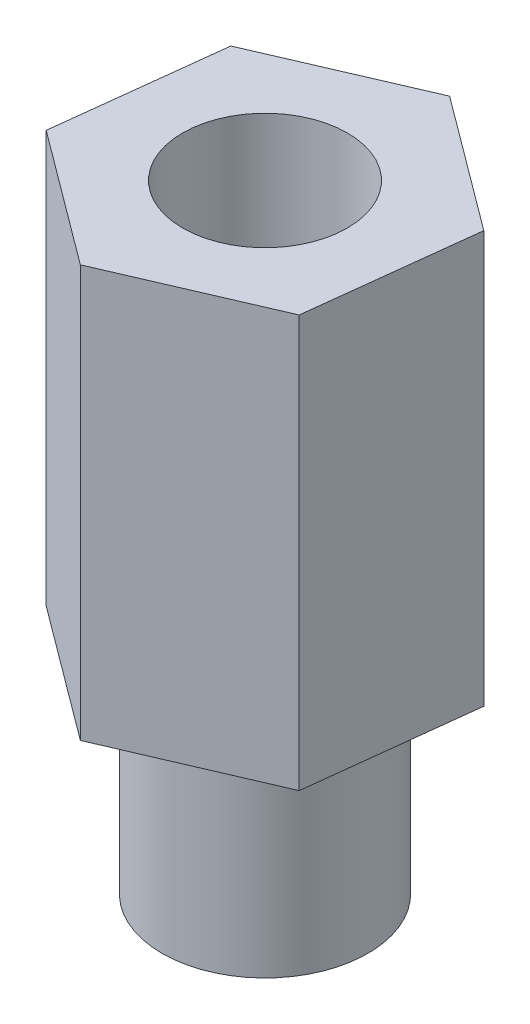
ISO-10303-21;
HEADER;
FILE_DESCRIPTION(('STEP AP214'),'2;1');
FILE_NAME('part.step','',(''),(''),'','','');
FILE_SCHEMA(('AUTOMOTIVE_DESIGN { 1 0 10303 214 1 1 1 1 }'));
ENDSEC;
DATA;
#1=APPLICATION_CONTEXT('core data for automotive mechanical design processes');
#2=APPLICATION_PROTOCOL_DEFINITION('international standard','automotive_design',2000,#1);
#3=PRODUCT_CONTEXT('',#1,'mechanical');
#4=PRODUCT('Part','Part','',(#3));
#5=PRODUCT_RELATED_PRODUCT_CATEGORY('part','',(#4));
#6=PRODUCT_DEFINITION_FORMATION('','',#4);
#7=PRODUCT_DEFINITION_CONTEXT('part definition',#1,'design');
#8=PRODUCT_DEFINITION('design','',#6,#7);
#9=PRODUCT_DEFINITION_SHAPE('','',#8);
#10=(LENGTH_UNIT() NAMED_UNIT(*) SI_UNIT(.MILLI.,.METRE.));
#11=(NAMED_UNIT(*) PLANE_ANGLE_UNIT() SI_UNIT($,.RADIAN.));
#12=(NAMED_UNIT(*) SI_UNIT($,.STERADIAN.) SOLID_ANGLE_UNIT());
#13=UNCERTAINTY_MEASURE_WITH_UNIT(LENGTH_MEASURE(1.E-05),#10,'distance_accuracy_value','');
#14=(GEOMETRIC_REPRESENTATION_CONTEXT(3) GLOBAL_UNCERTAINTY_ASSIGNED_CONTEXT((#13)) GLOBAL_UNIT_ASSIGNED_CONTEXT((#10,
#11,#12)) REPRESENTATION_CONTEXT('',''));
#15=CARTESIAN_POINT('',(0.,0.,0.));
#16=DIRECTION('',(0.,0.,1.));
#17=DIRECTION('',(1.,0.,0.));
#18=AXIS2_PLACEMENT_3D('',#15,#16,#17);
#19=CARTESIAN_POINT('',(0.,10.,0.));
#20=DIRECTION('',(0.,-1.,0.));
#21=DIRECTION('',(0.,0.,-1.));
#22=AXIS2_PLACEMENT_3D('',#19,#20,#21);
#23=CYLINDRICAL_SURFACE('',#22,5.);
#24=CARTESIAN_POINT('',(0.,10.,0.));
#25=DIRECTION('',(0.,1.,0.));
#26=DIRECTION('',(0.,0.,1.));
#27=AXIS2_PLACEMENT_3D('',#24,#25,#26);
#28=CIRCLE('',#27,5.);
#29=CARTESIAN_POINT('',(0.,10.,5.));
#30=VERTEX_POINT('',#29);
#31=EDGE_CURVE('E11',#30,#30,#28,.T.);
#32=ORIENTED_EDGE('',*,*,#31,.F.);
#33=EDGE_LOOP('',(#32));
#34=FACE_BOUND('',#33,.T.);
#35=CARTESIAN_POINT('',(0.,0.,0.));
#36=DIRECTION('',(0.,1.,0.));
#37=DIRECTION('',(0.,0.,1.));
#38=AXIS2_PLACEMENT_3D('',#35,#36,#37);
#39=CIRCLE('',#38,5.);
#40=CARTESIAN_POINT('',(0.,0.,5.));
#41=VERTEX_POINT('',#40);
#42=EDGE_CURVE('E35',#41,#41,#39,.T.);
#43=ORIENTED_EDGE('',*,*,#42,.T.);
#44=EDGE_LOOP('',(#43));
#45=FACE_BOUND('',#44,.T.);
#46=ADVANCED_FACE('F32',(#34,#45),#23,.T.);
#47=CARTESIAN_POINT('',(0.,0.,0.));
#48=DIRECTION('',(0.,1.,0.));
#49=DIRECTION('',(0.,0.,1.));
#50=AXIS2_PLACEMENT_3D('',#47,#48,#49);
#51=PLANE('',#50);
#52=CARTESIAN_POINT('',(0.,0.,0.));
#53=DIRECTION('',(0.,1.,0.));
#54=DIRECTION('',(0.,0.,1.));
#55=AXIS2_PLACEMENT_3D('',#52,#53,#54);
#56=CIRCLE('',#55,4.);
#57=CARTESIAN_POINT('',(0.,0.,4.));
#58=VERTEX_POINT('',#57);
#59=EDGE_CURVE('E121',#58,#58,#56,.T.);
#60=ORIENTED_EDGE('',*,*,#59,.T.);
#61=EDGE_LOOP('',(#60));
#62=FACE_BOUND('',#61,.T.);
#63=ORIENTED_EDGE('',*,*,#42,.F.);
#64=EDGE_LOOP('',(#63));
#65=FACE_BOUND('',#64,.T.);
#66=ADVANCED_FACE('F141',(#62,#65),#51,.F.);
#67=CARTESIAN_POINT('',(7.42102047232873,10.,-3.20340264135048));
#68=DIRECTION('',(0.,1.,0.));
#69=DIRECTION('',(0.,0.,1.));
#70=AXIS2_PLACEMENT_3D('',#67,#68,#69);
#71=PLANE('',#70);
#72=DIRECTION('',(0.115834877786811,0.,-0.993268483889484));
#73=VECTOR('',#72,1.);
#74=CARTESIAN_POINT('',(6.48473830212405,10.,4.82509093036584));
#75=LINE('',#74,#73);
#76=CARTESIAN_POINT('',(6.48473830212405,10.,4.82509093036584));
#77=VERTEX_POINT('',#76);
#78=CARTESIAN_POINT('',(7.42102047232873,10.,-3.20340264135048));
#79=VERTEX_POINT('',#78);
#80=EDGE_CURVE('E117',#77,#79,#75,.T.);
#81=ORIENTED_EDGE('',*,*,#80,.F.);
#82=DIRECTION('',(0.918113178720153,0.,-0.396318295137098));
#83=VECTOR('',#82,1.);
#84=CARTESIAN_POINT('',(-0.936282170204681,10.,8.02849357171631));
#85=LINE('',#84,#83);
#86=CARTESIAN_POINT('',(-0.936282170204681,10.,8.02849357171631));
#87=VERTEX_POINT('',#86);
#88=EDGE_CURVE('E77',#87,#77,#85,.T.);
#89=ORIENTED_EDGE('',*,*,#88,.F.);
#90=DIRECTION('',(0.802278300933342,0.,0.596950188752386));
#91=VECTOR('',#90,1.);
#92=CARTESIAN_POINT('',(-7.42102047232873,10.,3.20340264135048));
#93=LINE('',#92,#91);
#94=CARTESIAN_POINT('',(-7.42102047232873,10.,3.20340264135048));
#95=VERTEX_POINT('',#94);
#96=EDGE_CURVE('E71',#95,#87,#93,.T.);
#97=ORIENTED_EDGE('',*,*,#96,.F.);
#98=DIRECTION('',(-0.115834877786811,0.,0.993268483889484));
#99=VECTOR('',#98,1.);
#100=CARTESIAN_POINT('',(-6.48473830212405,10.,-4.82509093036584));
#101=LINE('',#100,#99);
#102=CARTESIAN_POINT('',(-6.48473830212405,10.,-4.82509093036584));
#103=VERTEX_POINT('',#102);
#104=EDGE_CURVE('E107',#103,#95,#101,.T.);
#105=ORIENTED_EDGE('',*,*,#104,.F.);
#106=DIRECTION('',(-0.918113178720154,0.,0.396318295137097));
#107=VECTOR('',#106,1.);
#108=CARTESIAN_POINT('',(0.936282170204681,10.,-8.02849357171631));
#109=LINE('',#108,#107);
#110=CARTESIAN_POINT('',(0.936282170204681,10.,-8.02849357171631));
#111=VERTEX_POINT('',#110);
#112=EDGE_CURVE('E123',#111,#103,#109,.T.);
#113=ORIENTED_EDGE('',*,*,#112,.F.);
#114=DIRECTION('',(-0.802278300933342,0.,-0.596950188752386));
#115=VECTOR('',#114,1.);
#116=CARTESIAN_POINT('',(7.42102047232873,10.,-3.20340264135048));
#117=LINE('',#116,#115);
#118=EDGE_CURVE('E120',#79,#111,#117,.T.);
#119=ORIENTED_EDGE('',*,*,#118,.F.);
#120=EDGE_LOOP('',(#81,#89,#97,#105,#113,#119));
#121=FACE_BOUND('',#120,.T.);
#122=ORIENTED_EDGE('',*,*,#31,.T.);
#123=EDGE_LOOP('',(#122));
#124=FACE_BOUND('',#123,.T.);
#125=ADVANCED_FACE('F143',(#121,#124),#71,.F.);
#126=CARTESIAN_POINT('',(6.48473830212405,30.,4.82509093036584));
#127=DIRECTION('',(-0.993268483889484,0.,-0.115834877786811));
#128=DIRECTION('',(-0.115834877786811,0.,0.993268483889484));
#129=AXIS2_PLACEMENT_3D('',#126,#127,#128);
#130=PLANE('',#129);
#131=ORIENTED_EDGE('',*,*,#80,.T.);
#132=DIRECTION('',(0.,-1.,0.));
#133=VECTOR('',#132,1.);
#134=CARTESIAN_POINT('',(7.42102047232873,30.,-3.20340264135048));
#135=LINE('',#134,#133);
#136=CARTESIAN_POINT('',(7.42102047232873,30.,-3.20340264135048));
#137=VERTEX_POINT('',#136);
#138=EDGE_CURVE('E135',#137,#79,#135,.T.);
#139=ORIENTED_EDGE('',*,*,#138,.F.);
#140=DIRECTION('',(0.115834877786811,0.,-0.993268483889484));
#141=VECTOR('',#140,1.);
#142=CARTESIAN_POINT('',(6.48473830212405,30.,4.82509093036584));
#143=LINE('',#142,#141);
#144=CARTESIAN_POINT('',(6.48473830212405,30.,4.82509093036584));
#145=VERTEX_POINT('',#144);
#146=EDGE_CURVE('E128',#145,#137,#143,.T.);
#147=ORIENTED_EDGE('',*,*,#146,.F.);
#148=DIRECTION('',(0.,-1.,0.));
#149=VECTOR('',#148,1.);
#150=CARTESIAN_POINT('',(6.48473830212405,30.,4.82509093036584));
#151=LINE('',#150,#149);
#152=EDGE_CURVE('E113',#145,#77,#151,.T.);
#153=ORIENTED_EDGE('',*,*,#152,.T.);
#154=EDGE_LOOP('',(#131,#139,#147,#153));
#155=FACE_BOUND('',#154,.T.);
#156=ADVANCED_FACE('F149',(#155),#130,.F.);
#157=CARTESIAN_POINT('',(7.42102047232873,30.,-3.20340264135048));
#158=DIRECTION('',(-0.596950188752386,0.,0.802278300933342));
#159=DIRECTION('',(0.802278300933342,0.,0.596950188752386));
#160=AXIS2_PLACEMENT_3D('',#157,#158,#159);
#161=PLANE('',#160);
#162=ORIENTED_EDGE('',*,*,#118,.T.);
#163=DIRECTION('',(0.,-1.,0.));
#164=VECTOR('',#163,1.);
#165=CARTESIAN_POINT('',(0.936282170204681,30.,-8.02849357171631));
#166=LINE('',#165,#164);
#167=CARTESIAN_POINT('',(0.936282170204681,30.,-8.02849357171631));
#168=VERTEX_POINT('',#167);
#169=EDGE_CURVE('E132',#168,#111,#166,.T.);
#170=ORIENTED_EDGE('',*,*,#169,.F.);
#171=DIRECTION('',(-0.802278300933342,0.,-0.596950188752386));
#172=VECTOR('',#171,1.);
#173=CARTESIAN_POINT('',(7.42102047232873,30.,-3.20340264135048));
#174=LINE('',#173,#172);
#175=EDGE_CURVE('E86',#137,#168,#174,.T.);
#176=ORIENTED_EDGE('',*,*,#175,.F.);
#177=ORIENTED_EDGE('',*,*,#138,.T.);
#178=EDGE_LOOP('',(#162,#170,#176,#177));
#179=FACE_BOUND('',#178,.T.);
#180=ADVANCED_FACE('F157',(#179),#161,.F.);
#181=CARTESIAN_POINT('',(0.936282170204681,30.,-8.02849357171631));
#182=DIRECTION('',(0.396318295137097,0.,0.918113178720154));
#183=DIRECTION('',(0.918113178720154,0.,-0.396318295137097));
#184=AXIS2_PLACEMENT_3D('',#181,#182,#183);
#185=PLANE('',#184);
#186=ORIENTED_EDGE('',*,*,#112,.T.);
#187=DIRECTION('',(0.,-1.,0.));
#188=VECTOR('',#187,1.);
#189=CARTESIAN_POINT('',(-6.48473830212405,30.,-4.82509093036584));
#190=LINE('',#189,#188);
#191=CARTESIAN_POINT('',(-6.48473830212405,30.,-4.82509093036584));
#192=VERTEX_POINT('',#191);
#193=EDGE_CURVE('E108',#192,#103,#190,.T.);
#194=ORIENTED_EDGE('',*,*,#193,.F.);
#195=DIRECTION('',(-0.918113178720154,0.,0.396318295137097));
#196=VECTOR('',#195,1.);
#197=CARTESIAN_POINT('',(0.936282170204681,30.,-8.02849357171631));
#198=LINE('',#197,#196);
#199=EDGE_CURVE('E99',#168,#192,#198,.T.);
#200=ORIENTED_EDGE('',*,*,#199,.F.);
#201=ORIENTED_EDGE('',*,*,#169,.T.);
#202=EDGE_LOOP('',(#186,#194,#200,#201));
#203=FACE_BOUND('',#202,.T.);
#204=ADVANCED_FACE('F161',(#203),#185,.F.);
#205=CARTESIAN_POINT('',(-6.48473830212405,30.,-4.82509093036584));
#206=DIRECTION('',(0.993268483889484,0.,0.115834877786811));
#207=DIRECTION('',(0.115834877786811,0.,-0.993268483889484));
#208=AXIS2_PLACEMENT_3D('',#205,#206,#207);
#209=PLANE('',#208);
#210=ORIENTED_EDGE('',*,*,#104,.T.);
#211=DIRECTION('',(0.,-1.,0.));
#212=VECTOR('',#211,1.);
#213=CARTESIAN_POINT('',(-7.42102047232873,30.,3.20340264135048));
#214=LINE('',#213,#212);
#215=CARTESIAN_POINT('',(-7.42102047232873,30.,3.20340264135048));
#216=VERTEX_POINT('',#215);
#217=EDGE_CURVE('E104',#216,#95,#214,.T.);
#218=ORIENTED_EDGE('',*,*,#217,.F.);
#219=DIRECTION('',(-0.115834877786811,0.,0.993268483889484));
#220=VECTOR('',#219,1.);
#221=CARTESIAN_POINT('',(-6.48473830212405,30.,-4.82509093036584));
#222=LINE('',#221,#220);
#223=EDGE_CURVE('E93',#192,#216,#222,.T.);
#224=ORIENTED_EDGE('',*,*,#223,.F.);
#225=ORIENTED_EDGE('',*,*,#193,.T.);
#226=EDGE_LOOP('',(#210,#218,#224,#225));
#227=FACE_BOUND('',#226,.T.);
#228=ADVANCED_FACE('F105',(#227),#209,.F.);
#229=CARTESIAN_POINT('',(-7.42102047232873,30.,3.20340264135048));
#230=DIRECTION('',(0.596950188752386,0.,-0.802278300933342));
#231=DIRECTION('',(-0.802278300933342,0.,-0.596950188752386));
#232=AXIS2_PLACEMENT_3D('',#229,#230,#231);
#233=PLANE('',#232);
#234=ORIENTED_EDGE('',*,*,#96,.T.);
#235=DIRECTION('',(0.,-1.,0.));
#236=VECTOR('',#235,1.);
#237=CARTESIAN_POINT('',(-0.936282170204681,30.,8.02849357171631));
#238=LINE('',#237,#236);
#239=CARTESIAN_POINT('',(-0.936282170204681,30.,8.02849357171631));
#240=VERTEX_POINT('',#239);
#241=EDGE_CURVE('E109',#240,#87,#238,.T.);
#242=ORIENTED_EDGE('',*,*,#241,.F.);
#243=DIRECTION('',(0.802278300933342,0.,0.596950188752386));
#244=VECTOR('',#243,1.);
#245=CARTESIAN_POINT('',(-7.42102047232873,30.,3.20340264135048));
#246=LINE('',#245,#244);
#247=EDGE_CURVE('E97',#216,#240,#246,.T.);
#248=ORIENTED_EDGE('',*,*,#247,.F.);
#249=ORIENTED_EDGE('',*,*,#217,.T.);
#250=EDGE_LOOP('',(#234,#242,#248,#249));
#251=FACE_BOUND('',#250,.T.);
#252=ADVANCED_FACE('F111',(#251),#233,.F.);
#253=CARTESIAN_POINT('',(-0.936282170204681,30.,8.02849357171631));
#254=DIRECTION('',(-0.396318295137098,0.,-0.918113178720154));
#255=DIRECTION('',(-0.918113178720154,0.,0.396318295137098));
#256=AXIS2_PLACEMENT_3D('',#253,#254,#255);
#257=PLANE('',#256);
#258=ORIENTED_EDGE('',*,*,#88,.T.);
#259=ORIENTED_EDGE('',*,*,#152,.F.);
#260=DIRECTION('',(0.918113178720153,0.,-0.396318295137098));
#261=VECTOR('',#260,1.);
#262=CARTESIAN_POINT('',(-0.936282170204681,30.,8.02849357171631));
#263=LINE('',#262,#261);
#264=EDGE_CURVE('E48',#240,#145,#263,.T.);
#265=ORIENTED_EDGE('',*,*,#264,.F.);
#266=ORIENTED_EDGE('',*,*,#241,.T.);
#267=EDGE_LOOP('',(#258,#259,#265,#266));
#268=FACE_BOUND('',#267,.T.);
#269=ADVANCED_FACE('F169',(#268),#257,.F.);
#270=CARTESIAN_POINT('',(7.42102047232873,30.,-3.20340264135048));
#271=DIRECTION('',(0.,1.,0.));
#272=DIRECTION('',(0.,0.,1.));
#273=AXIS2_PLACEMENT_3D('',#270,#271,#272);
#274=PLANE('',#273);
#275=CARTESIAN_POINT('',(0.,30.,0.));
#276=DIRECTION('',(0.,1.,0.));
#277=DIRECTION('',(0.,0.,1.));
#278=AXIS2_PLACEMENT_3D('',#275,#276,#277);
#279=CIRCLE('',#278,4.);
#280=CARTESIAN_POINT('',(0.,30.,4.));
#281=VERTEX_POINT('',#280);
#282=EDGE_CURVE('E184',#281,#281,#279,.T.);
#283=ORIENTED_EDGE('',*,*,#282,.F.);
#284=EDGE_LOOP('',(#283));
#285=FACE_BOUND('',#284,.T.);
#286=ORIENTED_EDGE('',*,*,#146,.T.);
#287=ORIENTED_EDGE('',*,*,#175,.T.);
#288=ORIENTED_EDGE('',*,*,#199,.T.);
#289=ORIENTED_EDGE('',*,*,#223,.T.);
#290=ORIENTED_EDGE('',*,*,#247,.T.);
#291=ORIENTED_EDGE('',*,*,#264,.T.);
#292=EDGE_LOOP('',(#286,#287,#288,#289,#290,#291));
#293=FACE_BOUND('',#292,.T.);
#294=ADVANCED_FACE('F95',(#285,#293),#274,.T.);
#295=CARTESIAN_POINT('',(0.,0.,0.));
#296=DIRECTION('',(0.,1.,0.));
#297=DIRECTION('',(0.,0.,1.));
#298=AXIS2_PLACEMENT_3D('',#295,#296,#297);
#299=CYLINDRICAL_SURFACE('',#298,4.);
#300=ORIENTED_EDGE('',*,*,#59,.F.);
#301=EDGE_LOOP('',(#300));
#302=FACE_BOUND('',#301,.T.);
#303=ORIENTED_EDGE('',*,*,#282,.T.);
#304=EDGE_LOOP('',(#303));
#305=FACE_BOUND('',#304,.T.);
#306=ADVANCED_FACE('F174',(#302,#305),#299,.F.);
#307=CLOSED_SHELL('',(#46,#66,#125,#156,#180,#204,#228,#252,#269,#294,#306));
#308=MANIFOLD_SOLID_BREP('B2',#307);
#309=ADVANCED_BREP_SHAPE_REPRESENTATION('',(#18,#308),#14);
#310=SHAPE_DEFINITION_REPRESENTATION(#9,#309);
ENDSEC;
END-ISO-10303-21;
